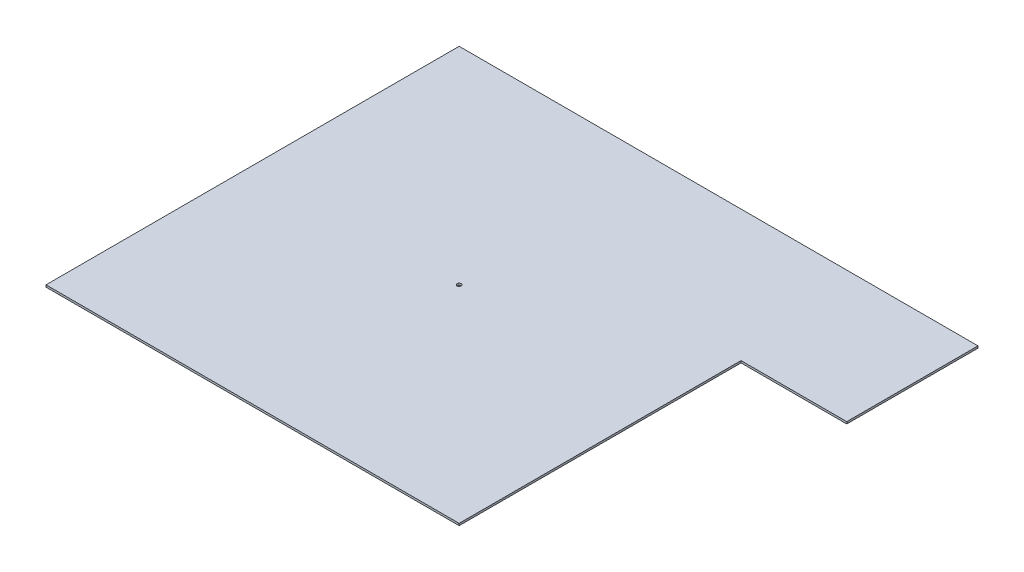
ISO-10303-21;
HEADER;
FILE_DESCRIPTION(('STEP AP214'),'2;1');
FILE_NAME('part.step','',(''),(''),'','','');
FILE_SCHEMA(('AUTOMOTIVE_DESIGN { 1 0 10303 214 1 1 1 1 }'));
ENDSEC;
DATA;
#1=APPLICATION_CONTEXT('core data for automotive mechanical design processes');
#2=APPLICATION_PROTOCOL_DEFINITION('international standard','automotive_design',2000,#1);
#3=PRODUCT_CONTEXT('',#1,'mechanical');
#4=PRODUCT('Part','Part','',(#3));
#5=PRODUCT_RELATED_PRODUCT_CATEGORY('part','',(#4));
#6=PRODUCT_DEFINITION_FORMATION('','',#4);
#7=PRODUCT_DEFINITION_CONTEXT('part definition',#1,'design');
#8=PRODUCT_DEFINITION('design','',#6,#7);
#9=PRODUCT_DEFINITION_SHAPE('','',#8);
#10=(LENGTH_UNIT() NAMED_UNIT(*) SI_UNIT(.MILLI.,.METRE.));
#11=(NAMED_UNIT(*) PLANE_ANGLE_UNIT() SI_UNIT($,.RADIAN.));
#12=(NAMED_UNIT(*) SI_UNIT($,.STERADIAN.) SOLID_ANGLE_UNIT());
#13=UNCERTAINTY_MEASURE_WITH_UNIT(LENGTH_MEASURE(1.E-05),#10,'distance_accuracy_value','');
#14=(GEOMETRIC_REPRESENTATION_CONTEXT(3) GLOBAL_UNCERTAINTY_ASSIGNED_CONTEXT((#13)) GLOBAL_UNIT_ASSIGNED_CONTEXT((#10,
#11,#12)) REPRESENTATION_CONTEXT('',''));
#15=CARTESIAN_POINT('',(0.,0.,0.));
#16=DIRECTION('',(0.,0.,1.));
#17=DIRECTION('',(1.,0.,0.));
#18=AXIS2_PLACEMENT_3D('',#15,#16,#17);
#19=CARTESIAN_POINT('',(2568.575,25.4,2568.575));
#20=DIRECTION('',(-1.,0.,0.));
#21=DIRECTION('',(0.,0.,1.));
#22=AXIS2_PLACEMENT_3D('',#19,#20,#21);
#23=PLANE('',#22);
#24=DIRECTION('',(0.,-1.,0.));
#25=VECTOR('',#24,1.);
#26=CARTESIAN_POINT('',(2568.575,2120.88075748741,-936.625000000002));
#27=LINE('',#26,#25);
#28=CARTESIAN_POINT('',(2568.575,25.4,-936.625000000001));
#29=VERTEX_POINT('',#28);
#30=CARTESIAN_POINT('',(2568.575,0.,-936.625000000002));
#31=VERTEX_POINT('',#30);
#32=EDGE_CURVE('E55',#29,#31,#27,.T.);
#33=ORIENTED_EDGE('',*,*,#32,.F.);
#34=DIRECTION('',(0.,0.,-1.));
#35=VECTOR('',#34,1.);
#36=CARTESIAN_POINT('',(2568.575,25.4,2568.575));
#37=LINE('',#36,#35);
#38=CARTESIAN_POINT('',(2568.575,25.4,2568.575));
#39=VERTEX_POINT('',#38);
#40=EDGE_CURVE('E139',#39,#29,#37,.T.);
#41=ORIENTED_EDGE('',*,*,#40,.F.);
#42=DIRECTION('',(0.,-1.,0.));
#43=VECTOR('',#42,1.);
#44=CARTESIAN_POINT('',(2568.575,25.4,2568.575));
#45=LINE('',#44,#43);
#46=CARTESIAN_POINT('',(2568.575,0.,2568.575));
#47=VERTEX_POINT('',#46);
#48=EDGE_CURVE('E145',#39,#47,#45,.T.);
#49=ORIENTED_EDGE('',*,*,#48,.T.);
#50=DIRECTION('',(0.,0.,-1.));
#51=VECTOR('',#50,1.);
#52=CARTESIAN_POINT('',(2568.575,0.,2568.575));
#53=LINE('',#52,#51);
#54=EDGE_CURVE('E112',#47,#31,#53,.T.);
#55=ORIENTED_EDGE('',*,*,#54,.T.);
#56=EDGE_LOOP('',(#33,#41,#49,#55));
#57=FACE_BOUND('',#56,.T.);
#58=ADVANCED_FACE('F41',(#57),#23,.F.);
#59=CARTESIAN_POINT('',(-2568.575,25.4,-2568.575));
#60=DIRECTION('',(0.,0.,1.));
#61=DIRECTION('',(1.,0.,0.));
#62=AXIS2_PLACEMENT_3D('',#59,#60,#61);
#63=PLANE('',#62);
#64=DIRECTION('',(-1.,0.,0.));
#65=VECTOR('',#64,1.);
#66=CARTESIAN_POINT('',(-2568.575,0.,-2568.575));
#67=LINE('',#66,#65);
#68=CARTESIAN_POINT('',(3883.025,0.,-2568.575));
#69=VERTEX_POINT('',#68);
#70=CARTESIAN_POINT('',(-2568.575,0.,-2568.575));
#71=VERTEX_POINT('',#70);
#72=EDGE_CURVE('E102',#69,#71,#67,.T.);
#73=ORIENTED_EDGE('',*,*,#72,.T.);
#74=DIRECTION('',(0.,-1.,0.));
#75=VECTOR('',#74,1.);
#76=CARTESIAN_POINT('',(-2568.575,25.4,-2568.575));
#77=LINE('',#76,#75);
#78=CARTESIAN_POINT('',(-2568.575,25.4,-2568.575));
#79=VERTEX_POINT('',#78);
#80=EDGE_CURVE('E11',#79,#71,#77,.T.);
#81=ORIENTED_EDGE('',*,*,#80,.F.);
#82=DIRECTION('',(-1.,0.,0.));
#83=VECTOR('',#82,1.);
#84=CARTESIAN_POINT('',(-2568.575,25.4,-2568.575));
#85=LINE('',#84,#83);
#86=CARTESIAN_POINT('',(3883.025,25.3999999999999,-2568.575));
#87=VERTEX_POINT('',#86);
#88=EDGE_CURVE('E85',#87,#79,#85,.T.);
#89=ORIENTED_EDGE('',*,*,#88,.F.);
#90=DIRECTION('',(0.,-1.,0.));
#91=VECTOR('',#90,1.);
#92=CARTESIAN_POINT('',(3883.025,2120.88075748741,-2568.575));
#93=LINE('',#92,#91);
#94=EDGE_CURVE('E115',#87,#69,#93,.T.);
#95=ORIENTED_EDGE('',*,*,#94,.T.);
#96=EDGE_LOOP('',(#73,#81,#89,#95));
#97=FACE_BOUND('',#96,.T.);
#98=ADVANCED_FACE('F116',(#97),#63,.F.);
#99=CARTESIAN_POINT('',(-2568.575,25.4,2568.575));
#100=DIRECTION('',(1.,0.,0.));
#101=DIRECTION('',(0.,0.,-1.));
#102=AXIS2_PLACEMENT_3D('',#99,#100,#101);
#103=PLANE('',#102);
#104=DIRECTION('',(0.,0.,1.));
#105=VECTOR('',#104,1.);
#106=CARTESIAN_POINT('',(-2568.575,0.,2568.575));
#107=LINE('',#106,#105);
#108=CARTESIAN_POINT('',(-2568.575,0.,2568.575));
#109=VERTEX_POINT('',#108);
#110=EDGE_CURVE('E110',#71,#109,#107,.T.);
#111=ORIENTED_EDGE('',*,*,#110,.T.);
#112=DIRECTION('',(0.,-1.,0.));
#113=VECTOR('',#112,1.);
#114=CARTESIAN_POINT('',(-2568.575,25.4,2568.575));
#115=LINE('',#114,#113);
#116=CARTESIAN_POINT('',(-2568.575,25.4,2568.575));
#117=VERTEX_POINT('',#116);
#118=EDGE_CURVE('E48',#117,#109,#115,.T.);
#119=ORIENTED_EDGE('',*,*,#118,.F.);
#120=DIRECTION('',(0.,0.,1.));
#121=VECTOR('',#120,1.);
#122=CARTESIAN_POINT('',(-2568.575,25.4,2568.575));
#123=LINE('',#122,#121);
#124=EDGE_CURVE('E142',#79,#117,#123,.T.);
#125=ORIENTED_EDGE('',*,*,#124,.F.);
#126=ORIENTED_EDGE('',*,*,#80,.T.);
#127=EDGE_LOOP('',(#111,#119,#125,#126));
#128=FACE_BOUND('',#127,.T.);
#129=ADVANCED_FACE('F167',(#128),#103,.F.);
#130=CARTESIAN_POINT('',(-2568.575,25.4,2568.575));
#131=DIRECTION('',(0.,0.,-1.));
#132=DIRECTION('',(-1.,0.,0.));
#133=AXIS2_PLACEMENT_3D('',#130,#131,#132);
#134=PLANE('',#133);
#135=DIRECTION('',(1.,0.,0.));
#136=VECTOR('',#135,1.);
#137=CARTESIAN_POINT('',(-2568.575,0.,2568.575));
#138=LINE('',#137,#136);
#139=EDGE_CURVE('E80',#109,#47,#138,.T.);
#140=ORIENTED_EDGE('',*,*,#139,.T.);
#141=ORIENTED_EDGE('',*,*,#48,.F.);
#142=DIRECTION('',(1.,0.,0.));
#143=VECTOR('',#142,1.);
#144=CARTESIAN_POINT('',(-2568.575,25.4,2568.575));
#145=LINE('',#144,#143);
#146=EDGE_CURVE('E63',#117,#39,#145,.T.);
#147=ORIENTED_EDGE('',*,*,#146,.F.);
#148=ORIENTED_EDGE('',*,*,#118,.T.);
#149=EDGE_LOOP('',(#140,#141,#147,#148));
#150=FACE_BOUND('',#149,.T.);
#151=ADVANCED_FACE('F150',(#150),#134,.F.);
#152=CARTESIAN_POINT('',(0.,25.4,0.));
#153=DIRECTION('',(0.,-1.,0.));
#154=DIRECTION('',(0.,0.,-1.));
#155=AXIS2_PLACEMENT_3D('',#152,#153,#154);
#156=PLANE('',#155);
#157=CARTESIAN_POINT('',(0.,25.4,0.));
#158=DIRECTION('',(0.,-1.,0.));
#159=DIRECTION('',(0.,0.,-1.));
#160=AXIS2_PLACEMENT_3D('',#157,#158,#159);
#161=CIRCLE('',#160,25.4);
#162=CARTESIAN_POINT('',(0.,25.4,-25.4));
#163=VERTEX_POINT('',#162);
#164=EDGE_CURVE('E133',#163,#163,#161,.T.);
#165=ORIENTED_EDGE('',*,*,#164,.T.);
#166=EDGE_LOOP('',(#165));
#167=FACE_BOUND('',#166,.T.);
#168=ORIENTED_EDGE('',*,*,#40,.T.);
#169=DIRECTION('',(1.,0.,0.));
#170=VECTOR('',#169,1.);
#171=CARTESIAN_POINT('',(3883.025,25.3999999999999,-936.625));
#172=LINE('',#171,#170);
#173=CARTESIAN_POINT('',(3883.025,25.3999999999999,-936.625));
#174=VERTEX_POINT('',#173);
#175=EDGE_CURVE('E127',#29,#174,#172,.T.);
#176=ORIENTED_EDGE('',*,*,#175,.T.);
#177=DIRECTION('',(0.,0.,-1.));
#178=VECTOR('',#177,1.);
#179=CARTESIAN_POINT('',(3883.025,25.3999999999999,-2568.575));
#180=LINE('',#179,#178);
#181=EDGE_CURVE('E131',#174,#87,#180,.T.);
#182=ORIENTED_EDGE('',*,*,#181,.T.);
#183=ORIENTED_EDGE('',*,*,#88,.T.);
#184=ORIENTED_EDGE('',*,*,#124,.T.);
#185=ORIENTED_EDGE('',*,*,#146,.T.);
#186=EDGE_LOOP('',(#168,#176,#182,#183,#184,#185));
#187=FACE_BOUND('',#186,.T.);
#188=ADVANCED_FACE('F156',(#167,#187),#156,.F.);
#189=CARTESIAN_POINT('',(0.,0.,0.));
#190=DIRECTION('',(0.,-1.,0.));
#191=DIRECTION('',(0.,0.,-1.));
#192=AXIS2_PLACEMENT_3D('',#189,#190,#191);
#193=PLANE('',#192);
#194=CARTESIAN_POINT('',(0.,0.,0.));
#195=DIRECTION('',(0.,-1.,0.));
#196=DIRECTION('',(0.,0.,-1.));
#197=AXIS2_PLACEMENT_3D('',#194,#195,#196);
#198=CIRCLE('',#197,25.4);
#199=CARTESIAN_POINT('',(0.,0.,-25.4));
#200=VERTEX_POINT('',#199);
#201=EDGE_CURVE('E136',#200,#200,#198,.T.);
#202=ORIENTED_EDGE('',*,*,#201,.F.);
#203=EDGE_LOOP('',(#202));
#204=FACE_BOUND('',#203,.T.);
#205=ORIENTED_EDGE('',*,*,#54,.F.);
#206=ORIENTED_EDGE('',*,*,#139,.F.);
#207=ORIENTED_EDGE('',*,*,#110,.F.);
#208=ORIENTED_EDGE('',*,*,#72,.F.);
#209=DIRECTION('',(0.,0.,1.));
#210=VECTOR('',#209,1.);
#211=CARTESIAN_POINT('',(3883.025,0.,-2568.575));
#212=LINE('',#211,#210);
#213=CARTESIAN_POINT('',(3883.025,0.,-936.625));
#214=VERTEX_POINT('',#213);
#215=EDGE_CURVE('E108',#69,#214,#212,.T.);
#216=ORIENTED_EDGE('',*,*,#215,.T.);
#217=DIRECTION('',(-1.,0.,0.));
#218=VECTOR('',#217,1.);
#219=CARTESIAN_POINT('',(3883.025,0.,-936.625));
#220=LINE('',#219,#218);
#221=EDGE_CURVE('E120',#214,#31,#220,.T.);
#222=ORIENTED_EDGE('',*,*,#221,.T.);
#223=EDGE_LOOP('',(#205,#206,#207,#208,#216,#222));
#224=FACE_BOUND('',#223,.T.);
#225=ADVANCED_FACE('F105',(#204,#224),#193,.T.);
#226=CARTESIAN_POINT('',(0.,25.4,0.));
#227=DIRECTION('',(0.,-1.,0.));
#228=DIRECTION('',(0.,0.,-1.));
#229=AXIS2_PLACEMENT_3D('',#226,#227,#228);
#230=CYLINDRICAL_SURFACE('',#229,25.4);
#231=ORIENTED_EDGE('',*,*,#164,.F.);
#232=EDGE_LOOP('',(#231));
#233=FACE_BOUND('',#232,.T.);
#234=ORIENTED_EDGE('',*,*,#201,.T.);
#235=EDGE_LOOP('',(#234));
#236=FACE_BOUND('',#235,.T.);
#237=ADVANCED_FACE('F164',(#233,#236),#230,.F.);
#238=CARTESIAN_POINT('',(3883.025,2120.88075748741,-936.625));
#239=DIRECTION('',(0.,0.,1.));
#240=DIRECTION('',(1.,0.,0.));
#241=AXIS2_PLACEMENT_3D('',#238,#239,#240);
#242=PLANE('',#241);
#243=ORIENTED_EDGE('',*,*,#175,.F.);
#244=ORIENTED_EDGE('',*,*,#32,.T.);
#245=ORIENTED_EDGE('',*,*,#221,.F.);
#246=DIRECTION('',(0.,-1.,0.));
#247=VECTOR('',#246,1.);
#248=CARTESIAN_POINT('',(3883.025,2120.88075748741,-936.625));
#249=LINE('',#248,#247);
#250=EDGE_CURVE('E119',#174,#214,#249,.T.);
#251=ORIENTED_EDGE('',*,*,#250,.F.);
#252=EDGE_LOOP('',(#243,#244,#245,#251));
#253=FACE_BOUND('',#252,.T.);
#254=ADVANCED_FACE('F155',(#253),#242,.T.);
#255=CARTESIAN_POINT('',(3883.025,2120.88075748741,-2568.575));
#256=DIRECTION('',(1.,0.,0.));
#257=DIRECTION('',(0.,0.,-1.));
#258=AXIS2_PLACEMENT_3D('',#255,#256,#257);
#259=PLANE('',#258);
#260=ORIENTED_EDGE('',*,*,#181,.F.);
#261=ORIENTED_EDGE('',*,*,#250,.T.);
#262=ORIENTED_EDGE('',*,*,#215,.F.);
#263=ORIENTED_EDGE('',*,*,#94,.F.);
#264=EDGE_LOOP('',(#260,#261,#262,#263));
#265=FACE_BOUND('',#264,.T.);
#266=ADVANCED_FACE('F122',(#265),#259,.T.);
#267=CLOSED_SHELL('',(#58,#98,#129,#151,#188,#225,#237,#254,#266));
#268=MANIFOLD_SOLID_BREP('B2',#267);
#269=ADVANCED_BREP_SHAPE_REPRESENTATION('',(#18,#268),#14);
#270=SHAPE_DEFINITION_REPRESENTATION(#9,#269);
ENDSEC;
END-ISO-10303-21;
